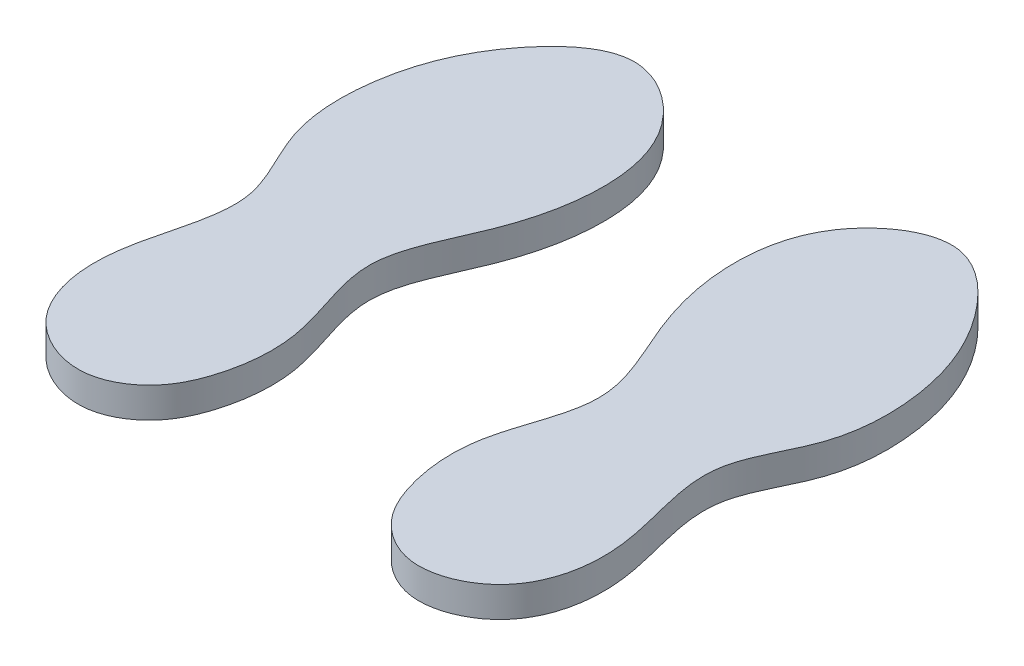
ISO-10303-21;
HEADER;
FILE_DESCRIPTION(('STEP AP214'),'2;1');
FILE_NAME('part.step','',(''),(''),'','','');
FILE_SCHEMA(('AUTOMOTIVE_DESIGN { 1 0 10303 214 1 1 1 1 }'));
ENDSEC;
DATA;
#1=APPLICATION_CONTEXT('core data for automotive mechanical design processes');
#2=APPLICATION_PROTOCOL_DEFINITION('international standard','automotive_design',2000,#1);
#3=PRODUCT_CONTEXT('',#1,'mechanical');
#4=PRODUCT('Part','Part','',(#3));
#5=PRODUCT_RELATED_PRODUCT_CATEGORY('part','',(#4));
#6=PRODUCT_DEFINITION_FORMATION('','',#4);
#7=PRODUCT_DEFINITION_CONTEXT('part definition',#1,'design');
#8=PRODUCT_DEFINITION('design','',#6,#7);
#9=PRODUCT_DEFINITION_SHAPE('','',#8);
#10=(LENGTH_UNIT() NAMED_UNIT(*) SI_UNIT(.MILLI.,.METRE.));
#11=(NAMED_UNIT(*) PLANE_ANGLE_UNIT() SI_UNIT($,.RADIAN.));
#12=(NAMED_UNIT(*) SI_UNIT($,.STERADIAN.) SOLID_ANGLE_UNIT());
#13=UNCERTAINTY_MEASURE_WITH_UNIT(LENGTH_MEASURE(1.E-05),#10,'distance_accuracy_value','');
#14=(GEOMETRIC_REPRESENTATION_CONTEXT(3) GLOBAL_UNCERTAINTY_ASSIGNED_CONTEXT((#13)) GLOBAL_UNIT_ASSIGNED_CONTEXT((#10,
#11,#12)) REPRESENTATION_CONTEXT('',''));
#15=CARTESIAN_POINT('',(0.,0.,0.));
#16=DIRECTION('',(0.,0.,1.));
#17=DIRECTION('',(1.,0.,0.));
#18=AXIS2_PLACEMENT_3D('',#15,#16,#17);
#19=CARTESIAN_POINT('',(-106.544097631231,20.,-392.449119023445));
#20=CARTESIAN_POINT('',(-122.65815007702,20.,-391.466501961389));
#21=CARTESIAN_POINT('',(-161.174594343398,20.,-358.166552056657));
#22=CARTESIAN_POINT('',(-182.823922909924,20.,-300.142147187541));
#23=CARTESIAN_POINT('',(-179.371588261215,20.,-236.959772497292));
#24=CARTESIAN_POINT('',(-143.322188010238,20.,-183.773719870874));
#25=CARTESIAN_POINT('',(-170.286769279226,20.,-125.556087091917));
#26=CARTESIAN_POINT('',(-167.436859462088,20.,-76.3403552883456));
#27=CARTESIAN_POINT('',(-147.656228747438,20.,-42.9463195989358));
#28=CARTESIAN_POINT('',(-109.87540857841,20.,-26.3151107609192));
#29=CARTESIAN_POINT('',(-74.5548434660917,20.,-48.6354108053348));
#30=CARTESIAN_POINT('',(-59.7412371814846,20.,-83.8710439159994));
#31=CARTESIAN_POINT('',(-56.2022566009172,20.,-132.58150185212));
#32=CARTESIAN_POINT('',(-86.9019300640636,20.,-189.336253954646));
#33=CARTESIAN_POINT('',(-54.2528943080986,20.,-247.024201151347));
#34=CARTESIAN_POINT('',(-39.3999486716392,20.,-305.112339134365));
#35=CARTESIAN_POINT('',(-48.6704149594782,20.,-365.596312937756));
#36=CARTESIAN_POINT('',(-88.9880894198005,20.,-393.51966495025));
#37=CARTESIAN_POINT('',(-106.544097631231,20.,-392.449119023445));
#38=B_SPLINE_CURVE_WITH_KNOTS('',3,(#19,#20,#21,#22,#23,#24,#25,#26,#27,#28,#29,#30,#31,#32,#33,
#34,#35,#36,#37),.UNSPECIFIED.,.T.,.F.,(4,1,1,1,1,1,1,1,1,1,1,1,1,1,1,1,4),(0.,
0.0607055196149032,0.156337144385481,0.218930962668298,0.279880894617364,0.369614909266824,
0.425901174856037,0.449068034638244,0.506702921585117,0.548647895397346,0.583423384402256,
0.640397756948705,0.718760147578821,0.793011406148093,0.859143311787868,0.933862285454031,1.),.UNSPECIFIED.);
#39=DIRECTION('',(0.,-1.,0.));
#40=VECTOR('',#39,1.);
#41=SURFACE_OF_LINEAR_EXTRUSION('',#38,#40);
#42=CARTESIAN_POINT('',(-106.544097631231,20.,-392.449119023445));
#43=VERTEX_POINT('',#42);
#44=EDGE_CURVE('E60',#43,#43,#38,.T.);
#45=ORIENTED_EDGE('',*,*,#44,.F.);
#46=EDGE_LOOP('',(#45));
#47=FACE_BOUND('',#46,.T.);
#48=CARTESIAN_POINT('',(-106.544097631231,0.,-392.449119023445));
#49=CARTESIAN_POINT('',(-122.65815007702,0.,-391.466501961389));
#50=CARTESIAN_POINT('',(-161.174594343398,0.,-358.166552056657));
#51=CARTESIAN_POINT('',(-182.823922909924,0.,-300.142147187541));
#52=CARTESIAN_POINT('',(-179.371588261215,0.,-236.959772497292));
#53=CARTESIAN_POINT('',(-143.322188010238,0.,-183.773719870874));
#54=CARTESIAN_POINT('',(-170.286769279226,0.,-125.556087091917));
#55=CARTESIAN_POINT('',(-167.436859462088,0.,-76.3403552883456));
#56=CARTESIAN_POINT('',(-147.656228747438,0.,-42.9463195989358));
#57=CARTESIAN_POINT('',(-109.87540857841,0.,-26.3151107609192));
#58=CARTESIAN_POINT('',(-74.5548434660917,0.,-48.6354108053348));
#59=CARTESIAN_POINT('',(-59.7412371814846,0.,-83.8710439159994));
#60=CARTESIAN_POINT('',(-56.2022566009172,0.,-132.58150185212));
#61=CARTESIAN_POINT('',(-86.9019300640636,0.,-189.336253954646));
#62=CARTESIAN_POINT('',(-54.2528943080986,0.,-247.024201151347));
#63=CARTESIAN_POINT('',(-39.3999486716392,0.,-305.112339134365));
#64=CARTESIAN_POINT('',(-48.6704149594782,0.,-365.596312937756));
#65=CARTESIAN_POINT('',(-88.9880894198005,0.,-393.51966495025));
#66=CARTESIAN_POINT('',(-106.544097631231,0.,-392.449119023445));
#67=B_SPLINE_CURVE_WITH_KNOTS('',3,(#48,#49,#50,#51,#52,#53,#54,#55,#56,#57,#58,#59,#60,#61,#62,
#63,#64,#65,#66),.UNSPECIFIED.,.T.,.F.,(4,1,1,1,1,1,1,1,1,1,1,1,1,1,1,1,4),(0.,
0.0607055196149032,0.156337144385481,0.218930962668298,0.279880894617364,0.369614909266824,
0.425901174856037,0.449068034638244,0.506702921585117,0.548647895397346,0.583423384402256,
0.640397756948705,0.718760147578821,0.793011406148093,0.859143311787868,0.933862285454031,1.),.UNSPECIFIED.);
#68=CARTESIAN_POINT('',(-106.544097631231,0.,-392.449119023445));
#69=VERTEX_POINT('',#68);
#70=EDGE_CURVE('E11',#69,#69,#67,.T.);
#71=ORIENTED_EDGE('',*,*,#70,.T.);
#72=EDGE_LOOP('',(#71));
#73=FACE_BOUND('',#72,.T.);
#74=ADVANCED_FACE('F52',(#47,#73),#41,.F.);
#75=CARTESIAN_POINT('',(-112.258688062991,20.,-33.8642791823593));
#76=DIRECTION('',(0.,-1.,0.));
#77=DIRECTION('',(0.,0.,-1.));
#78=AXIS2_PLACEMENT_3D('',#75,#76,#77);
#79=PLANE('',#78);
#80=ORIENTED_EDGE('',*,*,#44,.T.);
#81=EDGE_LOOP('',(#80));
#82=FACE_BOUND('',#81,.T.);
#83=ADVANCED_FACE('F54',(#82),#79,.F.);
#84=CARTESIAN_POINT('',(-112.258688062991,0.,-33.8642791823593));
#85=DIRECTION('',(0.,-1.,0.));
#86=DIRECTION('',(0.,0.,-1.));
#87=AXIS2_PLACEMENT_3D('',#84,#85,#86);
#88=PLANE('',#87);
#89=ORIENTED_EDGE('',*,*,#70,.F.);
#90=EDGE_LOOP('',(#89));
#91=FACE_BOUND('',#90,.T.);
#92=ADVANCED_FACE('F77',(#91),#88,.T.);
#93=CLOSED_SHELL('',(#74,#83,#92));
#94=MANIFOLD_SOLID_BREP('B2',#93);
#95=CARTESIAN_POINT('',(106.544097631231,20.,-392.449119023445));
#96=CARTESIAN_POINT('',(88.9880894198005,20.,-393.51966495025));
#97=CARTESIAN_POINT('',(48.6704149594783,20.,-365.596312937756));
#98=CARTESIAN_POINT('',(39.3999486716392,20.,-305.112339134365));
#99=CARTESIAN_POINT('',(54.2528943080986,20.,-247.024201151347));
#100=CARTESIAN_POINT('',(86.9019300640636,20.,-189.336253954646));
#101=CARTESIAN_POINT('',(56.2022566009173,20.,-132.58150185212));
#102=CARTESIAN_POINT('',(59.7412371814847,20.,-83.8710439159996));
#103=CARTESIAN_POINT('',(74.5548434660918,20.,-48.6354108053347));
#104=CARTESIAN_POINT('',(109.87540857841,20.,-26.3151107609193));
#105=CARTESIAN_POINT('',(147.656228747438,20.,-42.9463195989358));
#106=CARTESIAN_POINT('',(167.436859462088,20.,-76.3403552883456));
#107=CARTESIAN_POINT('',(170.286769279226,20.,-125.556087091917));
#108=CARTESIAN_POINT('',(143.322188010238,20.,-183.773719870874));
#109=CARTESIAN_POINT('',(179.371588261215,20.,-236.959772497292));
#110=CARTESIAN_POINT('',(182.823922909924,20.,-300.142147187541));
#111=CARTESIAN_POINT('',(161.174594343398,20.,-358.166552056657));
#112=CARTESIAN_POINT('',(122.65815007702,20.,-391.466501961389));
#113=CARTESIAN_POINT('',(106.544097631231,20.,-392.449119023445));
#114=B_SPLINE_CURVE_WITH_KNOTS('',3,(#95,#96,#97,#98,#99,#100,#101,#102,#103,#104,#105,#106,
#107,#108,#109,#110,#111,#112,#113),.UNSPECIFIED.,.T.,.F.,(4,1,1,1,1,1,1,1,1,1,1,1,1,1,1,1,4),
(0.,0.066137714545969,0.140856688212132,0.206988593851907,0.281239852421179,0.359602243051295,
0.416576615597744,0.451352104602654,0.493297078414883,0.550931965361756,0.574098825143963,
0.630385090733176,0.720119105382636,0.781069037331702,0.843662855614519,0.939294480385097,1.),.UNSPECIFIED.);
#115=DIRECTION('',(0.,-1.,0.));
#116=VECTOR('',#115,1.);
#117=SURFACE_OF_LINEAR_EXTRUSION('',#114,#116);
#118=CARTESIAN_POINT('',(106.544097631231,20.,-392.449119023445));
#119=VERTEX_POINT('',#118);
#120=EDGE_CURVE('E55',#119,#119,#114,.T.);
#121=ORIENTED_EDGE('',*,*,#120,.F.);
#122=EDGE_LOOP('',(#121));
#123=FACE_BOUND('',#122,.T.);
#124=CARTESIAN_POINT('',(106.544097631231,0.,-392.449119023445));
#125=CARTESIAN_POINT('',(88.9880894198005,0.,-393.51966495025));
#126=CARTESIAN_POINT('',(48.6704149594783,0.,-365.596312937756));
#127=CARTESIAN_POINT('',(39.3999486716392,0.,-305.112339134365));
#128=CARTESIAN_POINT('',(54.2528943080986,0.,-247.024201151347));
#129=CARTESIAN_POINT('',(86.9019300640636,0.,-189.336253954646));
#130=CARTESIAN_POINT('',(56.2022566009173,0.,-132.58150185212));
#131=CARTESIAN_POINT('',(59.7412371814847,0.,-83.8710439159996));
#132=CARTESIAN_POINT('',(74.5548434660918,0.,-48.6354108053347));
#133=CARTESIAN_POINT('',(109.87540857841,0.,-26.3151107609193));
#134=CARTESIAN_POINT('',(147.656228747438,0.,-42.9463195989358));
#135=CARTESIAN_POINT('',(167.436859462088,0.,-76.3403552883456));
#136=CARTESIAN_POINT('',(170.286769279226,0.,-125.556087091917));
#137=CARTESIAN_POINT('',(143.322188010238,0.,-183.773719870874));
#138=CARTESIAN_POINT('',(179.371588261215,0.,-236.959772497292));
#139=CARTESIAN_POINT('',(182.823922909924,0.,-300.142147187541));
#140=CARTESIAN_POINT('',(161.174594343398,0.,-358.166552056657));
#141=CARTESIAN_POINT('',(122.65815007702,0.,-391.466501961389));
#142=CARTESIAN_POINT('',(106.544097631231,0.,-392.449119023445));
#143=B_SPLINE_CURVE_WITH_KNOTS('',3,(#124,#125,#126,#127,#128,#129,#130,#131,#132,#133,#134,
#135,#136,#137,#138,#139,#140,#141,#142),.UNSPECIFIED.,.T.,.F.,(4,1,1,1,1,1,1,1,1,1,1,1,1,1,1,1,
4),(0.,0.066137714545969,0.140856688212132,0.206988593851907,0.281239852421179,
0.359602243051295,0.416576615597744,0.451352104602654,0.493297078414883,0.550931965361756,
0.574098825143963,0.630385090733176,0.720119105382636,0.781069037331702,0.843662855614519,
0.939294480385097,1.),.UNSPECIFIED.);
#144=CARTESIAN_POINT('',(106.544097631231,0.,-392.449119023445));
#145=VERTEX_POINT('',#144);
#146=EDGE_CURVE('E108',#145,#145,#143,.T.);
#147=ORIENTED_EDGE('',*,*,#146,.T.);
#148=EDGE_LOOP('',(#147));
#149=FACE_BOUND('',#148,.T.);
#150=ADVANCED_FACE('F104',(#123,#149),#117,.F.);
#151=CARTESIAN_POINT('',(112.258688062991,20.,-33.8642791823594));
#152=DIRECTION('',(0.,1.,0.));
#153=DIRECTION('',(0.,0.,1.));
#154=AXIS2_PLACEMENT_3D('',#151,#152,#153);
#155=PLANE('',#154);
#156=ORIENTED_EDGE('',*,*,#120,.T.);
#157=EDGE_LOOP('',(#156));
#158=FACE_BOUND('',#157,.T.);
#159=ADVANCED_FACE('F128',(#158),#155,.T.);
#160=CARTESIAN_POINT('',(112.258688062991,0.,-33.8642791823594));
#161=DIRECTION('',(0.,1.,0.));
#162=DIRECTION('',(0.,0.,1.));
#163=AXIS2_PLACEMENT_3D('',#160,#161,#162);
#164=PLANE('',#163);
#165=ORIENTED_EDGE('',*,*,#146,.F.);
#166=EDGE_LOOP('',(#165));
#167=FACE_BOUND('',#166,.T.);
#168=ADVANCED_FACE('F126',(#167),#164,.F.);
#169=CLOSED_SHELL('',(#150,#159,#168));
#170=MANIFOLD_SOLID_BREP('B6',#169);
#171=ADVANCED_BREP_SHAPE_REPRESENTATION('',(#18,#94,#170),#14);
#172=SHAPE_DEFINITION_REPRESENTATION(#9,#171);
ENDSEC;
END-ISO-10303-21;
